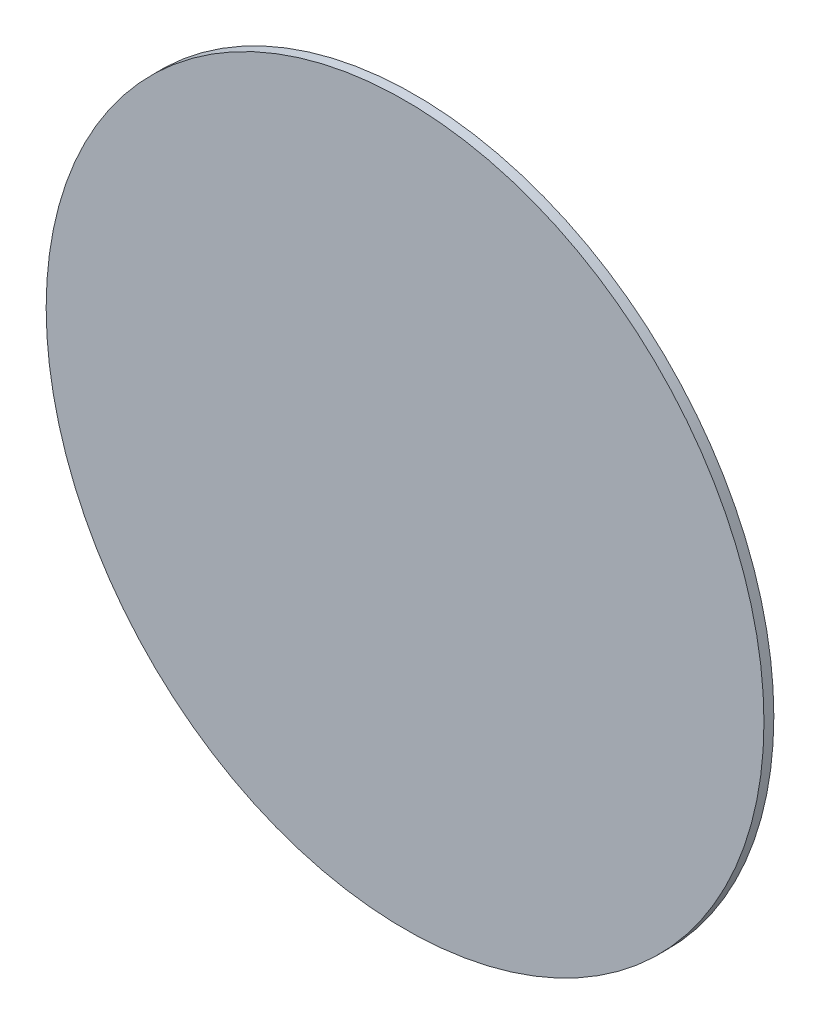
ISO-10303-21;
HEADER;
FILE_DESCRIPTION(('STEP AP214'),'2;1');
FILE_NAME('part.step','',(''),(''),'','','');
FILE_SCHEMA(('AUTOMOTIVE_DESIGN { 1 0 10303 214 1 1 1 1 }'));
ENDSEC;
DATA;
#1=APPLICATION_CONTEXT('core data for automotive mechanical design processes');
#2=APPLICATION_PROTOCOL_DEFINITION('international standard','automotive_design',2000,#1);
#3=PRODUCT_CONTEXT('',#1,'mechanical');
#4=PRODUCT('Part','Part','',(#3));
#5=PRODUCT_RELATED_PRODUCT_CATEGORY('part','',(#4));
#6=PRODUCT_DEFINITION_FORMATION('','',#4);
#7=PRODUCT_DEFINITION_CONTEXT('part definition',#1,'design');
#8=PRODUCT_DEFINITION('design','',#6,#7);
#9=PRODUCT_DEFINITION_SHAPE('','',#8);
#10=(LENGTH_UNIT() NAMED_UNIT(*) SI_UNIT(.MILLI.,.METRE.));
#11=(NAMED_UNIT(*) PLANE_ANGLE_UNIT() SI_UNIT($,.RADIAN.));
#12=(NAMED_UNIT(*) SI_UNIT($,.STERADIAN.) SOLID_ANGLE_UNIT());
#13=UNCERTAINTY_MEASURE_WITH_UNIT(LENGTH_MEASURE(1.E-05),#10,'distance_accuracy_value','');
#14=(GEOMETRIC_REPRESENTATION_CONTEXT(3) GLOBAL_UNCERTAINTY_ASSIGNED_CONTEXT((#13)) GLOBAL_UNIT_ASSIGNED_CONTEXT((#10,
#11,#12)) REPRESENTATION_CONTEXT('',''));
#15=CARTESIAN_POINT('',(0.,0.,0.));
#16=DIRECTION('',(0.,0.,1.));
#17=DIRECTION('',(1.,0.,0.));
#18=AXIS2_PLACEMENT_3D('',#15,#16,#17);
#19=CARTESIAN_POINT('',(0.,0.,3.));
#20=DIRECTION('',(0.,0.,-1.));
#21=DIRECTION('',(-1.,0.,0.));
#22=AXIS2_PLACEMENT_3D('',#19,#20,#21);
#23=CYLINDRICAL_SURFACE('',#22,109.);
#24=CARTESIAN_POINT('',(0.,0.,3.));
#25=DIRECTION('',(0.,0.,1.));
#26=DIRECTION('',(1.,0.,0.));
#27=AXIS2_PLACEMENT_3D('',#24,#25,#26);
#28=CIRCLE('',#27,109.);
#29=CARTESIAN_POINT('',(109.,0.,3.));
#30=VERTEX_POINT('',#29);
#31=EDGE_CURVE('E10',#30,#30,#28,.T.);
#32=ORIENTED_EDGE('',*,*,#31,.F.);
#33=EDGE_LOOP('',(#32));
#34=FACE_BOUND('',#33,.T.);
#35=CARTESIAN_POINT('',(0.,0.,0.));
#36=DIRECTION('',(0.,0.,1.));
#37=DIRECTION('',(1.,0.,0.));
#38=AXIS2_PLACEMENT_3D('',#35,#36,#37);
#39=CIRCLE('',#38,109.);
#40=CARTESIAN_POINT('',(109.,0.,0.));
#41=VERTEX_POINT('',#40);
#42=EDGE_CURVE('E40',#41,#41,#39,.T.);
#43=ORIENTED_EDGE('',*,*,#42,.T.);
#44=EDGE_LOOP('',(#43));
#45=FACE_BOUND('',#44,.T.);
#46=ADVANCED_FACE('F37',(#34,#45),#23,.T.);
#47=CARTESIAN_POINT('',(0.,0.,3.));
#48=DIRECTION('',(0.,0.,1.));
#49=DIRECTION('',(1.,0.,0.));
#50=AXIS2_PLACEMENT_3D('',#47,#48,#49);
#51=PLANE('',#50);
#52=ORIENTED_EDGE('',*,*,#31,.T.);
#53=EDGE_LOOP('',(#52));
#54=FACE_BOUND('',#53,.T.);
#55=ADVANCED_FACE('F56',(#54),#51,.T.);
#56=CARTESIAN_POINT('',(0.,0.,0.));
#57=DIRECTION('',(0.,0.,1.));
#58=DIRECTION('',(1.,0.,0.));
#59=AXIS2_PLACEMENT_3D('',#56,#57,#58);
#60=PLANE('',#59);
#61=ORIENTED_EDGE('',*,*,#42,.F.);
#62=EDGE_LOOP('',(#61));
#63=FACE_BOUND('',#62,.T.);
#64=ADVANCED_FACE('F54',(#63),#60,.F.);
#65=CLOSED_SHELL('',(#46,#55,#64));
#66=MANIFOLD_SOLID_BREP('B2',#65);
#67=ADVANCED_BREP_SHAPE_REPRESENTATION('',(#18,#66),#14);
#68=SHAPE_DEFINITION_REPRESENTATION(#9,#67);
ENDSEC;
END-ISO-10303-21;
